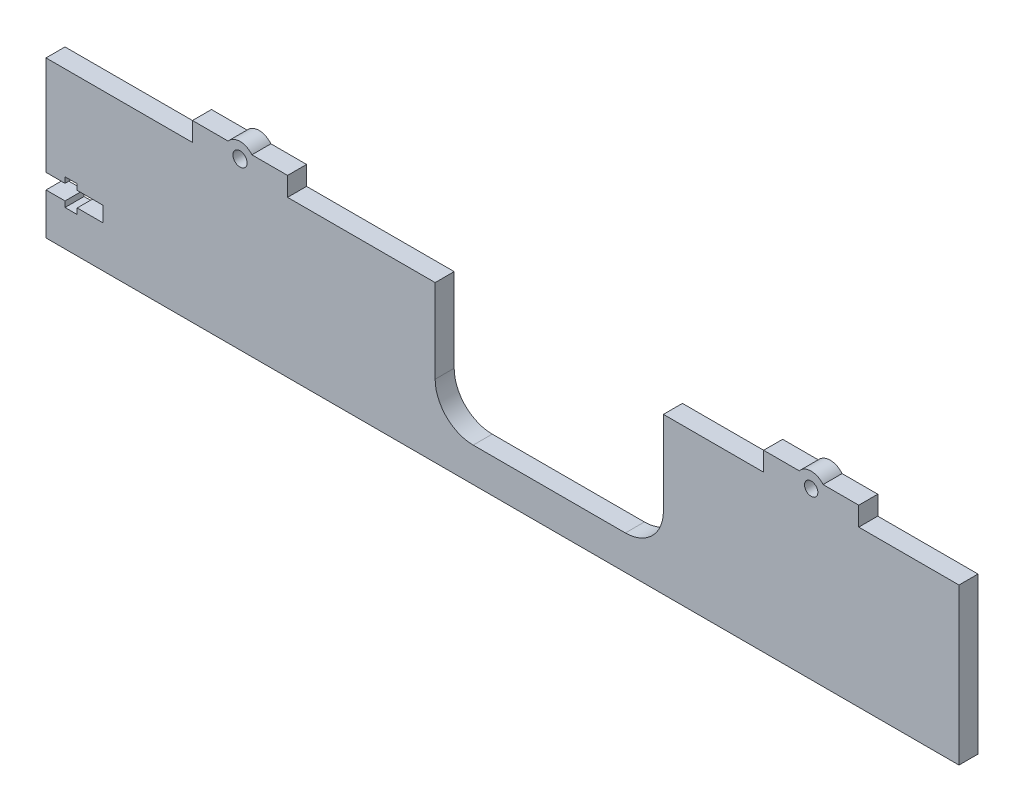
ISO-10303-21;
HEADER;
FILE_DESCRIPTION(('STEP AP214'),'2;1');
FILE_NAME('part.step','',(''),(''),'','','');
FILE_SCHEMA(('AUTOMOTIVE_DESIGN { 1 0 10303 214 1 1 1 1 }'));
ENDSEC;
DATA;
#1=APPLICATION_CONTEXT('core data for automotive mechanical design processes');
#2=APPLICATION_PROTOCOL_DEFINITION('international standard','automotive_design',2000,#1);
#3=PRODUCT_CONTEXT('',#1,'mechanical');
#4=PRODUCT('Part','Part','',(#3));
#5=PRODUCT_RELATED_PRODUCT_CATEGORY('part','',(#4));
#6=PRODUCT_DEFINITION_FORMATION('','',#4);
#7=PRODUCT_DEFINITION_CONTEXT('part definition',#1,'design');
#8=PRODUCT_DEFINITION('design','',#6,#7);
#9=PRODUCT_DEFINITION_SHAPE('','',#8);
#10=(LENGTH_UNIT() NAMED_UNIT(*) SI_UNIT(.MILLI.,.METRE.));
#11=(NAMED_UNIT(*) PLANE_ANGLE_UNIT() SI_UNIT($,.RADIAN.));
#12=(NAMED_UNIT(*) SI_UNIT($,.STERADIAN.) SOLID_ANGLE_UNIT());
#13=UNCERTAINTY_MEASURE_WITH_UNIT(LENGTH_MEASURE(1.E-05),#10,'distance_accuracy_value','');
#14=(GEOMETRIC_REPRESENTATION_CONTEXT(3) GLOBAL_UNCERTAINTY_ASSIGNED_CONTEXT((#13)) GLOBAL_UNIT_ASSIGNED_CONTEXT((#10,
#11,#12)) REPRESENTATION_CONTEXT('',''));
#15=CARTESIAN_POINT('',(0.,0.,0.));
#16=DIRECTION('',(0.,0.,1.));
#17=DIRECTION('',(1.,0.,0.));
#18=AXIS2_PLACEMENT_3D('',#15,#16,#17);
#19=CARTESIAN_POINT('',(-81.5,30.5,0.));
#20=DIRECTION('',(0.,1.,0.));
#21=DIRECTION('',(0.,0.,1.));
#22=AXIS2_PLACEMENT_3D('',#19,#20,#21);
#23=PLANE('',#22);
#24=DIRECTION('',(0.,0.,1.));
#25=VECTOR('',#24,1.);
#26=CARTESIAN_POINT('',(-72.1224989991912,30.5,0.));
#27=LINE('',#26,#25);
#28=CARTESIAN_POINT('',(-72.1224989991912,30.5,0.));
#29=VERTEX_POINT('',#28);
#30=CARTESIAN_POINT('',(-72.1224989991912,30.5,5.));
#31=VERTEX_POINT('',#30);
#32=EDGE_CURVE('E42',#29,#31,#27,.T.);
#33=ORIENTED_EDGE('',*,*,#32,.F.);
#34=DIRECTION('',(-1.,0.,0.));
#35=VECTOR('',#34,1.);
#36=CARTESIAN_POINT('',(-81.5,30.5,0.));
#37=LINE('',#36,#35);
#38=CARTESIAN_POINT('',(-81.5,30.5,0.));
#39=VERTEX_POINT('',#38);
#40=EDGE_CURVE('E395',#29,#39,#37,.T.);
#41=ORIENTED_EDGE('',*,*,#40,.T.);
#42=DIRECTION('',(0.,0.,1.));
#43=VECTOR('',#42,1.);
#44=CARTESIAN_POINT('',(-81.5,30.5,0.));
#45=LINE('',#44,#43);
#46=CARTESIAN_POINT('',(-81.5,30.5,5.));
#47=VERTEX_POINT('',#46);
#48=EDGE_CURVE('E373',#39,#47,#45,.T.);
#49=ORIENTED_EDGE('',*,*,#48,.T.);
#50=DIRECTION('',(-1.,0.,0.));
#51=VECTOR('',#50,1.);
#52=CARTESIAN_POINT('',(-81.5,30.5,5.));
#53=LINE('',#52,#51);
#54=EDGE_CURVE('E371',#31,#47,#53,.T.);
#55=ORIENTED_EDGE('',*,*,#54,.F.);
#56=EDGE_LOOP('',(#33,#41,#49,#55));
#57=FACE_BOUND('',#56,.T.);
#58=ADVANCED_FACE('F34',(#57),#23,.T.);
#59=CARTESIAN_POINT('',(68.65,30.5,0.));
#60=DIRECTION('',(0.,1.,0.));
#61=DIRECTION('',(0.,0.,1.));
#62=AXIS2_PLACEMENT_3D('',#59,#60,#61);
#63=PLANE('',#62);
#64=DIRECTION('',(0.,0.,1.));
#65=VECTOR('',#64,1.);
#66=CARTESIAN_POINT('',(78.0289907050887,30.5,0.));
#67=LINE('',#66,#65);
#68=CARTESIAN_POINT('',(78.0289907050887,30.5,0.));
#69=VERTEX_POINT('',#68);
#70=CARTESIAN_POINT('',(78.0289907050887,30.5,5.));
#71=VERTEX_POINT('',#70);
#72=EDGE_CURVE('E357',#69,#71,#67,.T.);
#73=ORIENTED_EDGE('',*,*,#72,.F.);
#74=DIRECTION('',(-1.,0.,0.));
#75=VECTOR('',#74,1.);
#76=CARTESIAN_POINT('',(68.65,30.5,0.));
#77=LINE('',#76,#75);
#78=CARTESIAN_POINT('',(68.65,30.5,0.));
#79=VERTEX_POINT('',#78);
#80=EDGE_CURVE('E466',#69,#79,#77,.T.);
#81=ORIENTED_EDGE('',*,*,#80,.T.);
#82=DIRECTION('',(0.,0.,1.));
#83=VECTOR('',#82,1.);
#84=CARTESIAN_POINT('',(68.65,30.5,0.));
#85=LINE('',#84,#83);
#86=CARTESIAN_POINT('',(68.65,30.5,5.));
#87=VERTEX_POINT('',#86);
#88=EDGE_CURVE('E479',#79,#87,#85,.T.);
#89=ORIENTED_EDGE('',*,*,#88,.T.);
#90=DIRECTION('',(-1.,0.,0.));
#91=VECTOR('',#90,1.);
#92=CARTESIAN_POINT('',(68.65,30.5,5.));
#93=LINE('',#92,#91);
#94=EDGE_CURVE('E476',#71,#87,#93,.T.);
#95=ORIENTED_EDGE('',*,*,#94,.F.);
#96=EDGE_LOOP('',(#73,#81,#89,#95));
#97=FACE_BOUND('',#96,.T.);
#98=ADVANCED_FACE('F572',(#97),#63,.T.);
#99=CARTESIAN_POINT('',(-120.,25.5,5.));
#100=DIRECTION('',(0.,-1.,0.));
#101=DIRECTION('',(0.,0.,-1.));
#102=AXIS2_PLACEMENT_3D('',#99,#100,#101);
#103=PLANE('',#102);
#104=DIRECTION('',(-1.,0.,0.));
#105=VECTOR('',#104,1.);
#106=CARTESIAN_POINT('',(-120.,25.5,5.));
#107=LINE('',#106,#105);
#108=CARTESIAN_POINT('',(68.65,25.5,5.));
#109=VERTEX_POINT('',#108);
#110=CARTESIAN_POINT('',(42.3,25.5,5.));
#111=VERTEX_POINT('',#110);
#112=EDGE_CURVE('E285',#109,#111,#107,.T.);
#113=ORIENTED_EDGE('',*,*,#112,.F.);
#114=DIRECTION('',(0.,0.,1.));
#115=VECTOR('',#114,1.);
#116=CARTESIAN_POINT('',(68.65,25.5,0.));
#117=LINE('',#116,#115);
#118=CARTESIAN_POINT('',(68.65,25.5,0.));
#119=VERTEX_POINT('',#118);
#120=EDGE_CURVE('E470',#119,#109,#117,.T.);
#121=ORIENTED_EDGE('',*,*,#120,.F.);
#122=DIRECTION('',(-1.,0.,0.));
#123=VECTOR('',#122,1.);
#124=CARTESIAN_POINT('',(-120.,25.5,0.));
#125=LINE('',#124,#123);
#126=CARTESIAN_POINT('',(42.3,25.5,0.));
#127=VERTEX_POINT('',#126);
#128=EDGE_CURVE('E295',#119,#127,#125,.T.);
#129=ORIENTED_EDGE('',*,*,#128,.T.);
#130=DIRECTION('',(0.,0.,1.));
#131=VECTOR('',#130,1.);
#132=CARTESIAN_POINT('',(42.3,25.5,-5.));
#133=LINE('',#132,#131);
#134=EDGE_CURVE('E507',#127,#111,#133,.T.);
#135=ORIENTED_EDGE('',*,*,#134,.T.);
#136=EDGE_LOOP('',(#113,#121,#129,#135));
#137=FACE_BOUND('',#136,.T.);
#138=ADVANCED_FACE('F567',(#137),#103,.F.);
#139=CARTESIAN_POINT('',(-17.7,25.5,5.));
#140=VERTEX_POINT('',#139);
#141=CARTESIAN_POINT('',(-56.5,25.5,5.));
#142=VERTEX_POINT('',#141);
#143=EDGE_CURVE('E277',#140,#142,#107,.T.);
#144=ORIENTED_EDGE('',*,*,#143,.F.);
#145=DIRECTION('',(0.,0.,1.));
#146=VECTOR('',#145,1.);
#147=CARTESIAN_POINT('',(-17.7,25.5,-5.));
#148=LINE('',#147,#146);
#149=CARTESIAN_POINT('',(-17.7,25.5,0.));
#150=VERTEX_POINT('',#149);
#151=EDGE_CURVE('E504',#150,#140,#148,.T.);
#152=ORIENTED_EDGE('',*,*,#151,.F.);
#153=CARTESIAN_POINT('',(-56.5,25.5,0.));
#154=VERTEX_POINT('',#153);
#155=EDGE_CURVE('E594',#150,#154,#125,.T.);
#156=ORIENTED_EDGE('',*,*,#155,.T.);
#157=DIRECTION('',(0.,0.,1.));
#158=VECTOR('',#157,1.);
#159=CARTESIAN_POINT('',(-56.5,25.5,0.));
#160=LINE('',#159,#158);
#161=EDGE_CURVE('E388',#154,#142,#160,.T.);
#162=ORIENTED_EDGE('',*,*,#161,.T.);
#163=EDGE_LOOP('',(#144,#152,#156,#162));
#164=FACE_BOUND('',#163,.T.);
#165=ADVANCED_FACE('F559',(#164),#103,.F.);
#166=CARTESIAN_POINT('',(-120.,25.5,5.));
#167=DIRECTION('',(1.,0.,0.));
#168=DIRECTION('',(0.,1.,0.));
#169=AXIS2_PLACEMENT_3D('',#166,#167,#168);
#170=PLANE('',#169);
#171=DIRECTION('',(0.,-1.,0.));
#172=VECTOR('',#171,1.);
#173=CARTESIAN_POINT('',(-120.,25.5,0.));
#174=LINE('',#173,#172);
#175=CARTESIAN_POINT('',(-120.,-4.56215806071958,0.));
#176=VERTEX_POINT('',#175);
#177=CARTESIAN_POINT('',(-120.,-15.5,0.));
#178=VERTEX_POINT('',#177);
#179=EDGE_CURVE('E290',#176,#178,#174,.T.);
#180=ORIENTED_EDGE('',*,*,#179,.T.);
#181=DIRECTION('',(0.,0.,1.));
#182=VECTOR('',#181,1.);
#183=CARTESIAN_POINT('',(-120.,-15.5,-5.));
#184=LINE('',#183,#182);
#185=CARTESIAN_POINT('',(-120.,-15.5,5.));
#186=VERTEX_POINT('',#185);
#187=EDGE_CURVE('E49',#178,#186,#184,.T.);
#188=ORIENTED_EDGE('',*,*,#187,.T.);
#189=DIRECTION('',(0.,-1.,0.));
#190=VECTOR('',#189,1.);
#191=CARTESIAN_POINT('',(-120.,25.5,5.));
#192=LINE('',#191,#190);
#193=CARTESIAN_POINT('',(-120.,-4.56215806071958,5.));
#194=VERTEX_POINT('',#193);
#195=EDGE_CURVE('E268',#194,#186,#192,.T.);
#196=ORIENTED_EDGE('',*,*,#195,.F.);
#197=DIRECTION('',(0.,0.,1.));
#198=VECTOR('',#197,1.);
#199=CARTESIAN_POINT('',(-120.,-4.56215806071958,-5.));
#200=LINE('',#199,#198);
#201=EDGE_CURVE('E404',#176,#194,#200,.T.);
#202=ORIENTED_EDGE('',*,*,#201,.F.);
#203=EDGE_LOOP('',(#180,#188,#196,#202));
#204=FACE_BOUND('',#203,.T.);
#205=ADVANCED_FACE('F556',(#204),#170,.F.);
#206=DIRECTION('',(0.,0.,1.));
#207=VECTOR('',#206,1.);
#208=CARTESIAN_POINT('',(-81.5,25.5,0.));
#209=LINE('',#208,#207);
#210=CARTESIAN_POINT('',(-81.5,25.5,0.));
#211=VERTEX_POINT('',#210);
#212=CARTESIAN_POINT('',(-81.5,25.5,5.));
#213=VERTEX_POINT('',#212);
#214=EDGE_CURVE('E390',#211,#213,#209,.T.);
#215=ORIENTED_EDGE('',*,*,#214,.F.);
#216=CARTESIAN_POINT('',(-120.,25.5,0.));
#217=VERTEX_POINT('',#216);
#218=EDGE_CURVE('E292',#211,#217,#125,.T.);
#219=ORIENTED_EDGE('',*,*,#218,.T.);
#220=DIRECTION('',(0.,0.,-1.));
#221=VECTOR('',#220,1.);
#222=CARTESIAN_POINT('',(-120.,25.5,5.));
#223=LINE('',#222,#221);
#224=CARTESIAN_POINT('',(-120.,25.5,5.));
#225=VERTEX_POINT('',#224);
#226=EDGE_CURVE('E284',#225,#217,#223,.T.);
#227=ORIENTED_EDGE('',*,*,#226,.F.);
#228=EDGE_CURVE('E274',#213,#225,#107,.T.);
#229=ORIENTED_EDGE('',*,*,#228,.F.);
#230=EDGE_LOOP('',(#215,#219,#227,#229));
#231=FACE_BOUND('',#230,.T.);
#232=ADVANCED_FACE('F558',(#231),#103,.F.);
#233=CARTESIAN_POINT('',(-120.,-0.562158060719575,0.));
#234=VERTEX_POINT('',#233);
#235=EDGE_CURVE('E286',#217,#234,#174,.T.);
#236=ORIENTED_EDGE('',*,*,#235,.T.);
#237=DIRECTION('',(0.,0.,1.));
#238=VECTOR('',#237,1.);
#239=CARTESIAN_POINT('',(-120.,-0.562158060719575,-5.));
#240=LINE('',#239,#238);
#241=CARTESIAN_POINT('',(-120.,-0.562158060719575,5.));
#242=VERTEX_POINT('',#241);
#243=EDGE_CURVE('E410',#234,#242,#240,.T.);
#244=ORIENTED_EDGE('',*,*,#243,.T.);
#245=EDGE_CURVE('E275',#225,#242,#192,.T.);
#246=ORIENTED_EDGE('',*,*,#245,.F.);
#247=ORIENTED_EDGE('',*,*,#226,.T.);
#248=EDGE_LOOP('',(#236,#244,#246,#247));
#249=FACE_BOUND('',#248,.T.);
#250=ADVANCED_FACE('F36',(#249),#170,.F.);
#251=CARTESIAN_POINT('',(120.,25.5,5.));
#252=DIRECTION('',(-1.,0.,0.));
#253=DIRECTION('',(0.,0.,1.));
#254=AXIS2_PLACEMENT_3D('',#251,#252,#253);
#255=PLANE('',#254);
#256=DIRECTION('',(0.,1.,0.));
#257=VECTOR('',#256,1.);
#258=CARTESIAN_POINT('',(120.,25.5,5.));
#259=LINE('',#258,#257);
#260=CARTESIAN_POINT('',(120.,-15.5,5.));
#261=VERTEX_POINT('',#260);
#262=CARTESIAN_POINT('',(120.,25.5,5.));
#263=VERTEX_POINT('',#262);
#264=EDGE_CURVE('E264',#261,#263,#259,.T.);
#265=ORIENTED_EDGE('',*,*,#264,.F.);
#266=DIRECTION('',(0.,0.,1.));
#267=VECTOR('',#266,1.);
#268=CARTESIAN_POINT('',(120.,-15.5,-5.));
#269=LINE('',#268,#267);
#270=CARTESIAN_POINT('',(120.,-15.5,0.));
#271=VERTEX_POINT('',#270);
#272=EDGE_CURVE('E252',#271,#261,#269,.T.);
#273=ORIENTED_EDGE('',*,*,#272,.F.);
#274=DIRECTION('',(0.,1.,0.));
#275=VECTOR('',#274,1.);
#276=CARTESIAN_POINT('',(120.,25.5,0.));
#277=LINE('',#276,#275);
#278=CARTESIAN_POINT('',(120.,25.5,0.));
#279=VERTEX_POINT('',#278);
#280=EDGE_CURVE('E289',#271,#279,#277,.T.);
#281=ORIENTED_EDGE('',*,*,#280,.T.);
#282=DIRECTION('',(0.,0.,-1.));
#283=VECTOR('',#282,1.);
#284=CARTESIAN_POINT('',(120.,25.5,5.));
#285=LINE('',#284,#283);
#286=EDGE_CURVE('E272',#263,#279,#285,.T.);
#287=ORIENTED_EDGE('',*,*,#286,.F.);
#288=EDGE_LOOP('',(#265,#273,#281,#287));
#289=FACE_BOUND('',#288,.T.);
#290=ADVANCED_FACE('F270',(#289),#255,.F.);
#291=CARTESIAN_POINT('',(93.65,25.5,0.));
#292=VERTEX_POINT('',#291);
#293=EDGE_CURVE('E293',#279,#292,#125,.T.);
#294=ORIENTED_EDGE('',*,*,#293,.T.);
#295=DIRECTION('',(0.,0.,1.));
#296=VECTOR('',#295,1.);
#297=CARTESIAN_POINT('',(93.65,25.5,0.));
#298=LINE('',#297,#296);
#299=CARTESIAN_POINT('',(93.65,25.5,5.));
#300=VERTEX_POINT('',#299);
#301=EDGE_CURVE('E485',#292,#300,#298,.T.);
#302=ORIENTED_EDGE('',*,*,#301,.T.);
#303=EDGE_CURVE('E279',#263,#300,#107,.T.);
#304=ORIENTED_EDGE('',*,*,#303,.F.);
#305=ORIENTED_EDGE('',*,*,#286,.T.);
#306=EDGE_LOOP('',(#294,#302,#304,#305));
#307=FACE_BOUND('',#306,.T.);
#308=ADVANCED_FACE('F566',(#307),#103,.F.);
#309=CARTESIAN_POINT('',(0.,0.,5.));
#310=DIRECTION('',(0.,0.,1.));
#311=DIRECTION('',(1.,0.,0.));
#312=AXIS2_PLACEMENT_3D('',#309,#310,#311);
#313=PLANE('',#312);
#314=DIRECTION('',(-1.,0.,0.));
#315=VECTOR('',#314,1.);
#316=CARTESIAN_POINT('',(-120.,-15.5,5.));
#317=LINE('',#316,#315);
#318=EDGE_CURVE('E255',#261,#186,#317,.T.);
#319=ORIENTED_EDGE('',*,*,#318,.F.);
#320=ORIENTED_EDGE('',*,*,#264,.T.);
#321=ORIENTED_EDGE('',*,*,#303,.T.);
#322=DIRECTION('',(0.,1.,0.));
#323=VECTOR('',#322,1.);
#324=CARTESIAN_POINT('',(93.65,25.5,5.));
#325=LINE('',#324,#323);
#326=CARTESIAN_POINT('',(93.65,30.5,5.));
#327=VERTEX_POINT('',#326);
#328=EDGE_CURVE('E473',#300,#327,#325,.T.);
#329=ORIENTED_EDGE('',*,*,#328,.T.);
#330=CARTESIAN_POINT('',(84.273988703487,30.5,5.));
#331=VERTEX_POINT('',#330);
#332=EDGE_CURVE('E463',#327,#331,#93,.T.);
#333=ORIENTED_EDGE('',*,*,#332,.T.);
#334=CARTESIAN_POINT('',(81.1514897042878,28.,5.));
#335=DIRECTION('',(0.,0.,1.));
#336=DIRECTION('',(1.,0.,0.));
#337=AXIS2_PLACEMENT_3D('',#334,#335,#336);
#338=CIRCLE('',#337,4.00000000000001);
#339=EDGE_CURVE('E446',#331,#71,#338,.T.);
#340=ORIENTED_EDGE('',*,*,#339,.T.);
#341=ORIENTED_EDGE('',*,*,#94,.T.);
#342=DIRECTION('',(0.,-1.,0.));
#343=VECTOR('',#342,1.);
#344=CARTESIAN_POINT('',(68.65,25.5,5.));
#345=LINE('',#344,#343);
#346=EDGE_CURVE('E355',#87,#109,#345,.T.);
#347=ORIENTED_EDGE('',*,*,#346,.T.);
#348=ORIENTED_EDGE('',*,*,#112,.T.);
#349=DIRECTION('',(0.,1.,0.));
#350=VECTOR('',#349,1.);
#351=CARTESIAN_POINT('',(42.3,25.5,5.));
#352=LINE('',#351,#350);
#353=CARTESIAN_POINT('',(42.3,3.50000000000007,5.));
#354=VERTEX_POINT('',#353);
#355=EDGE_CURVE('E500',#354,#111,#352,.T.);
#356=ORIENTED_EDGE('',*,*,#355,.F.);
#357=CARTESIAN_POINT('',(32.3,3.5,5.));
#358=DIRECTION('',(0.,0.,1.));
#359=DIRECTION('',(1.,0.,0.));
#360=AXIS2_PLACEMENT_3D('',#357,#358,#359);
#361=CIRCLE('',#360,9.99999999999999);
#362=CARTESIAN_POINT('',(32.2999999999999,-6.5,5.));
#363=VERTEX_POINT('',#362);
#364=EDGE_CURVE('E497',#363,#354,#361,.T.);
#365=ORIENTED_EDGE('',*,*,#364,.F.);
#366=DIRECTION('',(1.,0.,0.));
#367=VECTOR('',#366,1.);
#368=CARTESIAN_POINT('',(-7.69999999999992,-6.5,5.));
#369=LINE('',#368,#367);
#370=CARTESIAN_POINT('',(-7.69999999999992,-6.5,5.));
#371=VERTEX_POINT('',#370);
#372=EDGE_CURVE('E494',#371,#363,#369,.T.);
#373=ORIENTED_EDGE('',*,*,#372,.F.);
#374=CARTESIAN_POINT('',(-7.69999999999999,3.5,5.));
#375=DIRECTION('',(0.,0.,1.));
#376=DIRECTION('',(1.,0.,0.));
#377=AXIS2_PLACEMENT_3D('',#374,#375,#376);
#378=CIRCLE('',#377,10.);
#379=CARTESIAN_POINT('',(-17.7,3.50000000000007,5.));
#380=VERTEX_POINT('',#379);
#381=EDGE_CURVE('E491',#380,#371,#378,.T.);
#382=ORIENTED_EDGE('',*,*,#381,.F.);
#383=DIRECTION('',(0.,-1.,0.));
#384=VECTOR('',#383,1.);
#385=CARTESIAN_POINT('',(-17.7,25.5,5.));
#386=LINE('',#385,#384);
#387=EDGE_CURVE('E482',#140,#380,#386,.T.);
#388=ORIENTED_EDGE('',*,*,#387,.F.);
#389=ORIENTED_EDGE('',*,*,#143,.T.);
#390=DIRECTION('',(0.,1.,0.));
#391=VECTOR('',#390,1.);
#392=CARTESIAN_POINT('',(-56.5,25.5,5.));
#393=LINE('',#392,#391);
#394=CARTESIAN_POINT('',(-56.5,30.5,5.));
#395=VERTEX_POINT('',#394);
#396=EDGE_CURVE('E377',#142,#395,#393,.T.);
#397=ORIENTED_EDGE('',*,*,#396,.T.);
#398=CARTESIAN_POINT('',(-65.8775010007928,30.5,5.));
#399=VERTEX_POINT('',#398);
#400=EDGE_CURVE('E376',#395,#399,#53,.T.);
#401=ORIENTED_EDGE('',*,*,#400,.T.);
#402=CARTESIAN_POINT('',(-68.999999999992,28.,5.));
#403=DIRECTION('',(0.,0.,1.));
#404=DIRECTION('',(1.,0.,0.));
#405=AXIS2_PLACEMENT_3D('',#402,#403,#404);
#406=CIRCLE('',#405,4.00000000000001);
#407=EDGE_CURVE('E56',#399,#31,#406,.T.);
#408=ORIENTED_EDGE('',*,*,#407,.T.);
#409=ORIENTED_EDGE('',*,*,#54,.T.);
#410=DIRECTION('',(0.,-1.,0.));
#411=VECTOR('',#410,1.);
#412=CARTESIAN_POINT('',(-81.5,25.5,5.));
#413=LINE('',#412,#411);
#414=EDGE_CURVE('E381',#47,#213,#413,.T.);
#415=ORIENTED_EDGE('',*,*,#414,.T.);
#416=ORIENTED_EDGE('',*,*,#228,.T.);
#417=ORIENTED_EDGE('',*,*,#245,.T.);
#418=DIRECTION('',(-1.,0.,0.));
#419=VECTOR('',#418,1.);
#420=CARTESIAN_POINT('',(-120.,-0.562158060719575,5.));
#421=LINE('',#420,#419);
#422=CARTESIAN_POINT('',(-115.,-0.562158060719576,5.));
#423=VERTEX_POINT('',#422);
#424=EDGE_CURVE('E541',#423,#242,#421,.T.);
#425=ORIENTED_EDGE('',*,*,#424,.F.);
#426=DIRECTION('',(0.,-1.,0.));
#427=VECTOR('',#426,1.);
#428=CARTESIAN_POINT('',(-115.,0.937841939280424,5.));
#429=LINE('',#428,#427);
#430=CARTESIAN_POINT('',(-115.,0.937841939280424,5.));
#431=VERTEX_POINT('',#430);
#432=EDGE_CURVE('E539',#431,#423,#429,.T.);
#433=ORIENTED_EDGE('',*,*,#432,.F.);
#434=DIRECTION('',(-1.,0.,0.));
#435=VECTOR('',#434,1.);
#436=CARTESIAN_POINT('',(-111.8,0.937841939280424,5.));
#437=LINE('',#436,#435);
#438=CARTESIAN_POINT('',(-111.8,0.937841939280424,5.));
#439=VERTEX_POINT('',#438);
#440=EDGE_CURVE('E536',#439,#431,#437,.T.);
#441=ORIENTED_EDGE('',*,*,#440,.F.);
#442=DIRECTION('',(0.,1.,0.));
#443=VECTOR('',#442,1.);
#444=CARTESIAN_POINT('',(-111.8,-0.562158060719576,5.));
#445=LINE('',#444,#443);
#446=CARTESIAN_POINT('',(-111.8,-0.562158060719576,5.));
#447=VERTEX_POINT('',#446);
#448=EDGE_CURVE('E533',#447,#439,#445,.T.);
#449=ORIENTED_EDGE('',*,*,#448,.F.);
#450=DIRECTION('',(-1.,0.,0.));
#451=VECTOR('',#450,1.);
#452=CARTESIAN_POINT('',(-111.8,-0.562158060719576,5.));
#453=LINE('',#452,#451);
#454=CARTESIAN_POINT('',(-105.,-0.562158060719578,5.));
#455=VERTEX_POINT('',#454);
#456=EDGE_CURVE('E530',#455,#447,#453,.T.);
#457=ORIENTED_EDGE('',*,*,#456,.F.);
#458=DIRECTION('',(0.,1.,0.));
#459=VECTOR('',#458,1.);
#460=CARTESIAN_POINT('',(-105.,-0.562158060719578,5.));
#461=LINE('',#460,#459);
#462=CARTESIAN_POINT('',(-105.,-4.56215806071958,5.));
#463=VERTEX_POINT('',#462);
#464=EDGE_CURVE('E527',#463,#455,#461,.T.);
#465=ORIENTED_EDGE('',*,*,#464,.F.);
#466=DIRECTION('',(1.,0.,0.));
#467=VECTOR('',#466,1.);
#468=CARTESIAN_POINT('',(-105.,-4.56215806071958,5.));
#469=LINE('',#468,#467);
#470=CARTESIAN_POINT('',(-111.8,-4.56215806071958,5.));
#471=VERTEX_POINT('',#470);
#472=EDGE_CURVE('E524',#471,#463,#469,.T.);
#473=ORIENTED_EDGE('',*,*,#472,.F.);
#474=DIRECTION('',(0.,1.,0.));
#475=VECTOR('',#474,1.);
#476=CARTESIAN_POINT('',(-111.8,-6.06215806071958,5.));
#477=LINE('',#476,#475);
#478=CARTESIAN_POINT('',(-111.8,-6.06215806071958,5.));
#479=VERTEX_POINT('',#478);
#480=EDGE_CURVE('E521',#479,#471,#477,.T.);
#481=ORIENTED_EDGE('',*,*,#480,.F.);
#482=DIRECTION('',(1.,0.,0.));
#483=VECTOR('',#482,1.);
#484=CARTESIAN_POINT('',(-115.,-6.06215806071958,5.));
#485=LINE('',#484,#483);
#486=CARTESIAN_POINT('',(-115.,-6.06215806071958,5.));
#487=VERTEX_POINT('',#486);
#488=EDGE_CURVE('E518',#487,#479,#485,.T.);
#489=ORIENTED_EDGE('',*,*,#488,.F.);
#490=DIRECTION('',(0.,-1.,0.));
#491=VECTOR('',#490,1.);
#492=CARTESIAN_POINT('',(-115.,-4.56215806071958,5.));
#493=LINE('',#492,#491);
#494=CARTESIAN_POINT('',(-115.,-4.56215806071958,5.));
#495=VERTEX_POINT('',#494);
#496=EDGE_CURVE('E506',#495,#487,#493,.T.);
#497=ORIENTED_EDGE('',*,*,#496,.F.);
#498=DIRECTION('',(1.,0.,0.));
#499=VECTOR('',#498,1.);
#500=CARTESIAN_POINT('',(-115.,-4.56215806071958,5.));
#501=LINE('',#500,#499);
#502=EDGE_CURVE('E413',#194,#495,#501,.T.);
#503=ORIENTED_EDGE('',*,*,#502,.F.);
#504=ORIENTED_EDGE('',*,*,#195,.T.);
#505=EDGE_LOOP('',(#319,#320,#321,#329,#333,#340,#341,#347,#348,#356,#365,#373,#382,#388,#389,
#397,#401,#408,#409,#415,#416,#417,#425,#433,#441,#449,#457,#465,#473,#481,#489,#497,#503,#504));
#506=FACE_BOUND('',#505,.T.);
#507=CARTESIAN_POINT('',(81.1514897042878,28.,5.));
#508=DIRECTION('',(0.,0.,1.));
#509=DIRECTION('',(1.,0.,0.));
#510=AXIS2_PLACEMENT_3D('',#507,#508,#509);
#511=CIRCLE('',#510,1.74832903256121);
#512=CARTESIAN_POINT('',(82.8998187368491,28.,5.));
#513=VERTEX_POINT('',#512);
#514=EDGE_CURVE('E453',#513,#513,#511,.T.);
#515=ORIENTED_EDGE('',*,*,#514,.F.);
#516=EDGE_LOOP('',(#515));
#517=FACE_BOUND('',#516,.T.);
#518=CARTESIAN_POINT('',(-68.999999999992,28.,5.));
#519=DIRECTION('',(0.,0.,1.));
#520=DIRECTION('',(1.,0.,0.));
#521=AXIS2_PLACEMENT_3D('',#518,#519,#520);
#522=CIRCLE('',#521,1.86392887683881);
#523=CARTESIAN_POINT('',(-67.1360711231532,28.,5.));
#524=VERTEX_POINT('',#523);
#525=EDGE_CURVE('E352',#524,#524,#522,.T.);
#526=ORIENTED_EDGE('',*,*,#525,.F.);
#527=EDGE_LOOP('',(#526));
#528=FACE_BOUND('',#527,.T.);
#529=ADVANCED_FACE('F261',(#506,#517,#528),#313,.T.);
#530=CARTESIAN_POINT('',(0.,0.,0.));
#531=DIRECTION('',(0.,0.,1.));
#532=DIRECTION('',(1.,0.,0.));
#533=AXIS2_PLACEMENT_3D('',#530,#531,#532);
#534=PLANE('',#533);
#535=ORIENTED_EDGE('',*,*,#280,.F.);
#536=DIRECTION('',(-1.,0.,0.));
#537=VECTOR('',#536,1.);
#538=CARTESIAN_POINT('',(0.,-15.5,0.));
#539=LINE('',#538,#537);
#540=EDGE_CURVE('E11',#271,#178,#539,.T.);
#541=ORIENTED_EDGE('',*,*,#540,.T.);
#542=ORIENTED_EDGE('',*,*,#179,.F.);
#543=DIRECTION('',(1.,0.,0.));
#544=VECTOR('',#543,1.);
#545=CARTESIAN_POINT('',(0.,-4.56215806071958,0.));
#546=LINE('',#545,#544);
#547=CARTESIAN_POINT('',(-115.,-4.56215806071958,0.));
#548=VERTEX_POINT('',#547);
#549=EDGE_CURVE('E329',#176,#548,#546,.T.);
#550=ORIENTED_EDGE('',*,*,#549,.T.);
#551=DIRECTION('',(0.,-1.,0.));
#552=VECTOR('',#551,1.);
#553=CARTESIAN_POINT('',(-115.,0.,0.));
#554=LINE('',#553,#552);
#555=CARTESIAN_POINT('',(-115.,-6.06215806071958,0.));
#556=VERTEX_POINT('',#555);
#557=EDGE_CURVE('E326',#548,#556,#554,.T.);
#558=ORIENTED_EDGE('',*,*,#557,.T.);
#559=DIRECTION('',(1.,0.,0.));
#560=VECTOR('',#559,1.);
#561=CARTESIAN_POINT('',(0.,-6.06215806071958,0.));
#562=LINE('',#561,#560);
#563=CARTESIAN_POINT('',(-111.8,-6.06215806071958,0.));
#564=VERTEX_POINT('',#563);
#565=EDGE_CURVE('E299',#556,#564,#562,.T.);
#566=ORIENTED_EDGE('',*,*,#565,.T.);
#567=DIRECTION('',(0.,1.,0.));
#568=VECTOR('',#567,1.);
#569=CARTESIAN_POINT('',(-111.8,0.,0.));
#570=LINE('',#569,#568);
#571=CARTESIAN_POINT('',(-111.8,-4.56215806071958,0.));
#572=VERTEX_POINT('',#571);
#573=EDGE_CURVE('E302',#564,#572,#570,.T.);
#574=ORIENTED_EDGE('',*,*,#573,.T.);
#575=DIRECTION('',(1.,0.,0.));
#576=VECTOR('',#575,1.);
#577=CARTESIAN_POINT('',(0.,-4.56215806071958,0.));
#578=LINE('',#577,#576);
#579=CARTESIAN_POINT('',(-105.,-4.56215806071958,0.));
#580=VERTEX_POINT('',#579);
#581=EDGE_CURVE('E305',#572,#580,#578,.T.);
#582=ORIENTED_EDGE('',*,*,#581,.T.);
#583=DIRECTION('',(0.,1.,0.));
#584=VECTOR('',#583,1.);
#585=CARTESIAN_POINT('',(-105.,0.,0.));
#586=LINE('',#585,#584);
#587=CARTESIAN_POINT('',(-105.,-0.562158060719578,0.));
#588=VERTEX_POINT('',#587);
#589=EDGE_CURVE('E308',#580,#588,#586,.T.);
#590=ORIENTED_EDGE('',*,*,#589,.T.);
#591=DIRECTION('',(-1.,0.,0.));
#592=VECTOR('',#591,1.);
#593=CARTESIAN_POINT('',(0.,-0.56215806071961,0.));
#594=LINE('',#593,#592);
#595=CARTESIAN_POINT('',(-111.8,-0.562158060719576,0.));
#596=VERTEX_POINT('',#595);
#597=EDGE_CURVE('E311',#588,#596,#594,.T.);
#598=ORIENTED_EDGE('',*,*,#597,.T.);
#599=DIRECTION('',(0.,1.,0.));
#600=VECTOR('',#599,1.);
#601=CARTESIAN_POINT('',(-111.8,0.,0.));
#602=LINE('',#601,#600);
#603=CARTESIAN_POINT('',(-111.8,0.937841939280424,0.));
#604=VERTEX_POINT('',#603);
#605=EDGE_CURVE('E314',#596,#604,#602,.T.);
#606=ORIENTED_EDGE('',*,*,#605,.T.);
#607=DIRECTION('',(-1.,0.,0.));
#608=VECTOR('',#607,1.);
#609=CARTESIAN_POINT('',(0.,0.937841939280424,0.));
#610=LINE('',#609,#608);
#611=CARTESIAN_POINT('',(-115.,0.937841939280424,0.));
#612=VERTEX_POINT('',#611);
#613=EDGE_CURVE('E317',#604,#612,#610,.T.);
#614=ORIENTED_EDGE('',*,*,#613,.T.);
#615=DIRECTION('',(0.,-1.,0.));
#616=VECTOR('',#615,1.);
#617=CARTESIAN_POINT('',(-115.,0.,0.));
#618=LINE('',#617,#616);
#619=CARTESIAN_POINT('',(-115.,-0.562158060719576,0.));
#620=VERTEX_POINT('',#619);
#621=EDGE_CURVE('E320',#612,#620,#618,.T.);
#622=ORIENTED_EDGE('',*,*,#621,.T.);
#623=DIRECTION('',(-1.,0.,0.));
#624=VECTOR('',#623,1.);
#625=CARTESIAN_POINT('',(0.,-0.562158060719586,0.));
#626=LINE('',#625,#624);
#627=EDGE_CURVE('E323',#620,#234,#626,.T.);
#628=ORIENTED_EDGE('',*,*,#627,.T.);
#629=ORIENTED_EDGE('',*,*,#235,.F.);
#630=ORIENTED_EDGE('',*,*,#218,.F.);
#631=DIRECTION('',(0.,-1.,0.));
#632=VECTOR('',#631,1.);
#633=CARTESIAN_POINT('',(-81.5,25.5,0.));
#634=LINE('',#633,#632);
#635=EDGE_CURVE('E379',#39,#211,#634,.T.);
#636=ORIENTED_EDGE('',*,*,#635,.F.);
#637=ORIENTED_EDGE('',*,*,#40,.F.);
#638=CARTESIAN_POINT('',(-68.999999999992,28.,0.));
#639=DIRECTION('',(0.,0.,1.));
#640=DIRECTION('',(1.,0.,0.));
#641=AXIS2_PLACEMENT_3D('',#638,#639,#640);
#642=CIRCLE('',#641,4.00000000000001);
#643=CARTESIAN_POINT('',(-65.8775010007928,30.5,0.));
#644=VERTEX_POINT('',#643);
#645=EDGE_CURVE('E367',#644,#29,#642,.T.);
#646=ORIENTED_EDGE('',*,*,#645,.F.);
#647=CARTESIAN_POINT('',(-56.5,30.5,0.));
#648=VERTEX_POINT('',#647);
#649=EDGE_CURVE('E391',#648,#644,#37,.T.);
#650=ORIENTED_EDGE('',*,*,#649,.F.);
#651=DIRECTION('',(0.,1.,0.));
#652=VECTOR('',#651,1.);
#653=CARTESIAN_POINT('',(-56.5,25.5,0.));
#654=LINE('',#653,#652);
#655=EDGE_CURVE('E399',#154,#648,#654,.T.);
#656=ORIENTED_EDGE('',*,*,#655,.F.);
#657=ORIENTED_EDGE('',*,*,#155,.F.);
#658=DIRECTION('',(0.,-1.,0.));
#659=VECTOR('',#658,1.);
#660=CARTESIAN_POINT('',(-17.7,0.,0.));
#661=LINE('',#660,#659);
#662=CARTESIAN_POINT('',(-17.7,3.50000000000007,0.));
#663=VERTEX_POINT('',#662);
#664=EDGE_CURVE('E344',#150,#663,#661,.T.);
#665=ORIENTED_EDGE('',*,*,#664,.T.);
#666=CARTESIAN_POINT('',(-7.69999999999999,3.5,0.));
#667=DIRECTION('',(0.,0.,1.));
#668=DIRECTION('',(1.,0.,0.));
#669=AXIS2_PLACEMENT_3D('',#666,#667,#668);
#670=CIRCLE('',#669,10.);
#671=CARTESIAN_POINT('',(-7.69999999999992,-6.5,0.));
#672=VERTEX_POINT('',#671);
#673=EDGE_CURVE('E332',#663,#672,#670,.T.);
#674=ORIENTED_EDGE('',*,*,#673,.T.);
#675=DIRECTION('',(1.,0.,0.));
#676=VECTOR('',#675,1.);
#677=CARTESIAN_POINT('',(0.,-6.5,0.));
#678=LINE('',#677,#676);
#679=CARTESIAN_POINT('',(32.2999999999999,-6.5,0.));
#680=VERTEX_POINT('',#679);
#681=EDGE_CURVE('E335',#672,#680,#678,.T.);
#682=ORIENTED_EDGE('',*,*,#681,.T.);
#683=CARTESIAN_POINT('',(32.3,3.5,0.));
#684=DIRECTION('',(0.,0.,1.));
#685=DIRECTION('',(1.,0.,0.));
#686=AXIS2_PLACEMENT_3D('',#683,#684,#685);
#687=CIRCLE('',#686,9.99999999999999);
#688=CARTESIAN_POINT('',(42.3,3.50000000000007,0.));
#689=VERTEX_POINT('',#688);
#690=EDGE_CURVE('E338',#680,#689,#687,.T.);
#691=ORIENTED_EDGE('',*,*,#690,.T.);
#692=DIRECTION('',(0.,1.,0.));
#693=VECTOR('',#692,1.);
#694=CARTESIAN_POINT('',(42.3,0.,0.));
#695=LINE('',#694,#693);
#696=EDGE_CURVE('E341',#689,#127,#695,.T.);
#697=ORIENTED_EDGE('',*,*,#696,.T.);
#698=ORIENTED_EDGE('',*,*,#128,.F.);
#699=DIRECTION('',(0.,-1.,0.));
#700=VECTOR('',#699,1.);
#701=CARTESIAN_POINT('',(68.65,25.5,0.));
#702=LINE('',#701,#700);
#703=EDGE_CURVE('E459',#79,#119,#702,.T.);
#704=ORIENTED_EDGE('',*,*,#703,.F.);
#705=ORIENTED_EDGE('',*,*,#80,.F.);
#706=CARTESIAN_POINT('',(81.1514897042878,28.,0.));
#707=DIRECTION('',(0.,0.,1.));
#708=DIRECTION('',(1.,0.,0.));
#709=AXIS2_PLACEMENT_3D('',#706,#707,#708);
#710=CIRCLE('',#709,4.00000000000001);
#711=CARTESIAN_POINT('',(84.273988703487,30.5,0.));
#712=VERTEX_POINT('',#711);
#713=EDGE_CURVE('E448',#712,#69,#710,.T.);
#714=ORIENTED_EDGE('',*,*,#713,.F.);
#715=CARTESIAN_POINT('',(93.65,30.5,0.));
#716=VERTEX_POINT('',#715);
#717=EDGE_CURVE('E467',#716,#712,#77,.T.);
#718=ORIENTED_EDGE('',*,*,#717,.F.);
#719=DIRECTION('',(0.,1.,0.));
#720=VECTOR('',#719,1.);
#721=CARTESIAN_POINT('',(93.65,25.5,0.));
#722=LINE('',#721,#720);
#723=EDGE_CURVE('E462',#292,#716,#722,.T.);
#724=ORIENTED_EDGE('',*,*,#723,.F.);
#725=ORIENTED_EDGE('',*,*,#293,.F.);
#726=EDGE_LOOP('',(#535,#541,#542,#550,#558,#566,#574,#582,#590,#598,#606,#614,#622,#628,#629,
#630,#636,#637,#646,#650,#656,#657,#665,#674,#682,#691,#697,#698,#704,#705,#714,#718,#724,#725));
#727=FACE_BOUND('',#726,.T.);
#728=CARTESIAN_POINT('',(81.1514897042878,28.,0.));
#729=DIRECTION('',(0.,0.,1.));
#730=DIRECTION('',(1.,0.,0.));
#731=AXIS2_PLACEMENT_3D('',#728,#729,#730);
#732=CIRCLE('',#731,1.74832903256121);
#733=CARTESIAN_POINT('',(82.8998187368491,28.,0.));
#734=VERTEX_POINT('',#733);
#735=EDGE_CURVE('E348',#734,#734,#732,.T.);
#736=ORIENTED_EDGE('',*,*,#735,.T.);
#737=EDGE_LOOP('',(#736));
#738=FACE_BOUND('',#737,.T.);
#739=CARTESIAN_POINT('',(-68.999999999992,28.,0.));
#740=DIRECTION('',(0.,0.,1.));
#741=DIRECTION('',(1.,0.,0.));
#742=AXIS2_PLACEMENT_3D('',#739,#740,#741);
#743=CIRCLE('',#742,1.86392887683881);
#744=CARTESIAN_POINT('',(-67.1360711231532,28.,0.));
#745=VERTEX_POINT('',#744);
#746=EDGE_CURVE('E351',#745,#745,#743,.T.);
#747=ORIENTED_EDGE('',*,*,#746,.T.);
#748=EDGE_LOOP('',(#747));
#749=FACE_BOUND('',#748,.T.);
#750=ADVANCED_FACE('F444',(#727,#738,#749),#534,.F.);
#751=CARTESIAN_POINT('',(-81.5,25.5,0.));
#752=DIRECTION('',(-1.,0.,0.));
#753=DIRECTION('',(0.,0.,1.));
#754=AXIS2_PLACEMENT_3D('',#751,#752,#753);
#755=PLANE('',#754);
#756=ORIENTED_EDGE('',*,*,#414,.F.);
#757=ORIENTED_EDGE('',*,*,#48,.F.);
#758=ORIENTED_EDGE('',*,*,#635,.T.);
#759=ORIENTED_EDGE('',*,*,#214,.T.);
#760=EDGE_LOOP('',(#756,#757,#758,#759));
#761=FACE_BOUND('',#760,.T.);
#762=ADVANCED_FACE('F584',(#761),#755,.T.);
#763=DIRECTION('',(0.,0.,1.));
#764=VECTOR('',#763,1.);
#765=CARTESIAN_POINT('',(-65.8775010007928,30.5,0.));
#766=LINE('',#765,#764);
#767=EDGE_CURVE('E360',#399,#644,#766,.F.);
#768=ORIENTED_EDGE('',*,*,#767,.F.);
#769=ORIENTED_EDGE('',*,*,#400,.F.);
#770=DIRECTION('',(0.,0.,1.));
#771=VECTOR('',#770,1.);
#772=CARTESIAN_POINT('',(-56.5,30.5,0.));
#773=LINE('',#772,#771);
#774=EDGE_CURVE('E386',#648,#395,#773,.T.);
#775=ORIENTED_EDGE('',*,*,#774,.F.);
#776=ORIENTED_EDGE('',*,*,#649,.T.);
#777=EDGE_LOOP('',(#768,#769,#775,#776));
#778=FACE_BOUND('',#777,.T.);
#779=ADVANCED_FACE('F574',(#778),#23,.T.);
#780=CARTESIAN_POINT('',(-56.5,25.5,0.));
#781=DIRECTION('',(1.,0.,0.));
#782=DIRECTION('',(0.,0.,-1.));
#783=AXIS2_PLACEMENT_3D('',#780,#781,#782);
#784=PLANE('',#783);
#785=ORIENTED_EDGE('',*,*,#396,.F.);
#786=ORIENTED_EDGE('',*,*,#161,.F.);
#787=ORIENTED_EDGE('',*,*,#655,.T.);
#788=ORIENTED_EDGE('',*,*,#774,.T.);
#789=EDGE_LOOP('',(#785,#786,#787,#788));
#790=FACE_BOUND('',#789,.T.);
#791=ADVANCED_FACE('F441',(#790),#784,.T.);
#792=CARTESIAN_POINT('',(-115.,-4.56215806071958,-5.));
#793=DIRECTION('',(-1.,0.,0.));
#794=DIRECTION('',(0.,0.,1.));
#795=AXIS2_PLACEMENT_3D('',#792,#793,#794);
#796=PLANE('',#795);
#797=DIRECTION('',(0.,0.,1.));
#798=VECTOR('',#797,1.);
#799=CARTESIAN_POINT('',(-115.,-4.56215806071958,-5.));
#800=LINE('',#799,#798);
#801=EDGE_CURVE('E402',#548,#495,#800,.T.);
#802=ORIENTED_EDGE('',*,*,#801,.T.);
#803=ORIENTED_EDGE('',*,*,#496,.T.);
#804=DIRECTION('',(0.,0.,1.));
#805=VECTOR('',#804,1.);
#806=CARTESIAN_POINT('',(-115.,-6.06215806071958,-5.));
#807=LINE('',#806,#805);
#808=EDGE_CURVE('E434',#556,#487,#807,.T.);
#809=ORIENTED_EDGE('',*,*,#808,.F.);
#810=ORIENTED_EDGE('',*,*,#557,.F.);
#811=EDGE_LOOP('',(#802,#803,#809,#810));
#812=FACE_BOUND('',#811,.T.);
#813=ADVANCED_FACE('F551',(#812),#796,.F.);
#814=CARTESIAN_POINT('',(-115.,-4.56215806071958,-5.));
#815=DIRECTION('',(0.,-1.,0.));
#816=DIRECTION('',(0.,0.,-1.));
#817=AXIS2_PLACEMENT_3D('',#814,#815,#816);
#818=PLANE('',#817);
#819=ORIENTED_EDGE('',*,*,#201,.T.);
#820=ORIENTED_EDGE('',*,*,#502,.T.);
#821=ORIENTED_EDGE('',*,*,#801,.F.);
#822=ORIENTED_EDGE('',*,*,#549,.F.);
#823=EDGE_LOOP('',(#819,#820,#821,#822));
#824=FACE_BOUND('',#823,.T.);
#825=ADVANCED_FACE('F546',(#824),#818,.F.);
#826=CARTESIAN_POINT('',(-120.,-0.562158060719575,-5.));
#827=DIRECTION('',(0.,1.,0.));
#828=DIRECTION('',(-1.,0.,0.));
#829=AXIS2_PLACEMENT_3D('',#826,#827,#828);
#830=PLANE('',#829);
#831=DIRECTION('',(0.,0.,1.));
#832=VECTOR('',#831,1.);
#833=CARTESIAN_POINT('',(-115.,-0.562158060719576,-5.));
#834=LINE('',#833,#832);
#835=EDGE_CURVE('E418',#620,#423,#834,.T.);
#836=ORIENTED_EDGE('',*,*,#835,.T.);
#837=ORIENTED_EDGE('',*,*,#424,.T.);
#838=ORIENTED_EDGE('',*,*,#243,.F.);
#839=ORIENTED_EDGE('',*,*,#627,.F.);
#840=EDGE_LOOP('',(#836,#837,#838,#839));
#841=FACE_BOUND('',#840,.T.);
#842=ADVANCED_FACE('F600',(#841),#830,.F.);
#843=CARTESIAN_POINT('',(-115.,0.937841939280424,-5.));
#844=DIRECTION('',(-1.,0.,0.));
#845=DIRECTION('',(0.,0.,1.));
#846=AXIS2_PLACEMENT_3D('',#843,#844,#845);
#847=PLANE('',#846);
#848=DIRECTION('',(0.,0.,1.));
#849=VECTOR('',#848,1.);
#850=CARTESIAN_POINT('',(-115.,0.937841939280424,-5.));
#851=LINE('',#850,#849);
#852=EDGE_CURVE('E420',#612,#431,#851,.T.);
#853=ORIENTED_EDGE('',*,*,#852,.T.);
#854=ORIENTED_EDGE('',*,*,#432,.T.);
#855=ORIENTED_EDGE('',*,*,#835,.F.);
#856=ORIENTED_EDGE('',*,*,#621,.F.);
#857=EDGE_LOOP('',(#853,#854,#855,#856));
#858=FACE_BOUND('',#857,.T.);
#859=ADVANCED_FACE('F602',(#858),#847,.F.);
#860=CARTESIAN_POINT('',(-111.8,0.937841939280424,-5.));
#861=DIRECTION('',(0.,1.,0.));
#862=DIRECTION('',(0.,0.,1.));
#863=AXIS2_PLACEMENT_3D('',#860,#861,#862);
#864=PLANE('',#863);
#865=DIRECTION('',(0.,0.,1.));
#866=VECTOR('',#865,1.);
#867=CARTESIAN_POINT('',(-111.8,0.937841939280424,-5.));
#868=LINE('',#867,#866);
#869=EDGE_CURVE('E422',#604,#439,#868,.T.);
#870=ORIENTED_EDGE('',*,*,#869,.T.);
#871=ORIENTED_EDGE('',*,*,#440,.T.);
#872=ORIENTED_EDGE('',*,*,#852,.F.);
#873=ORIENTED_EDGE('',*,*,#613,.F.);
#874=EDGE_LOOP('',(#870,#871,#872,#873));
#875=FACE_BOUND('',#874,.T.);
#876=ADVANCED_FACE('F609',(#875),#864,.F.);
#877=CARTESIAN_POINT('',(-111.8,-0.562158060719576,-5.));
#878=DIRECTION('',(1.,0.,0.));
#879=DIRECTION('',(0.,0.,-1.));
#880=AXIS2_PLACEMENT_3D('',#877,#878,#879);
#881=PLANE('',#880);
#882=DIRECTION('',(0.,0.,1.));
#883=VECTOR('',#882,1.);
#884=CARTESIAN_POINT('',(-111.8,-0.562158060719576,-5.));
#885=LINE('',#884,#883);
#886=EDGE_CURVE('E424',#596,#447,#885,.T.);
#887=ORIENTED_EDGE('',*,*,#886,.T.);
#888=ORIENTED_EDGE('',*,*,#448,.T.);
#889=ORIENTED_EDGE('',*,*,#869,.F.);
#890=ORIENTED_EDGE('',*,*,#605,.F.);
#891=EDGE_LOOP('',(#887,#888,#889,#890));
#892=FACE_BOUND('',#891,.T.);
#893=ADVANCED_FACE('F612',(#892),#881,.F.);
#894=CARTESIAN_POINT('',(-111.8,-0.562158060719576,-5.));
#895=DIRECTION('',(0.,1.,0.));
#896=DIRECTION('',(-1.,0.,0.));
#897=AXIS2_PLACEMENT_3D('',#894,#895,#896);
#898=PLANE('',#897);
#899=DIRECTION('',(0.,0.,1.));
#900=VECTOR('',#899,1.);
#901=CARTESIAN_POINT('',(-105.,-0.562158060719578,-5.));
#902=LINE('',#901,#900);
#903=EDGE_CURVE('E426',#588,#455,#902,.T.);
#904=ORIENTED_EDGE('',*,*,#903,.T.);
#905=ORIENTED_EDGE('',*,*,#456,.T.);
#906=ORIENTED_EDGE('',*,*,#886,.F.);
#907=ORIENTED_EDGE('',*,*,#597,.F.);
#908=EDGE_LOOP('',(#904,#905,#906,#907));
#909=FACE_BOUND('',#908,.T.);
#910=ADVANCED_FACE('F615',(#909),#898,.F.);
#911=CARTESIAN_POINT('',(-105.,-0.562158060719578,-5.));
#912=DIRECTION('',(1.,0.,0.));
#913=DIRECTION('',(0.,0.,-1.));
#914=AXIS2_PLACEMENT_3D('',#911,#912,#913);
#915=PLANE('',#914);
#916=DIRECTION('',(0.,0.,1.));
#917=VECTOR('',#916,1.);
#918=CARTESIAN_POINT('',(-105.,-4.56215806071958,-5.));
#919=LINE('',#918,#917);
#920=EDGE_CURVE('E428',#580,#463,#919,.T.);
#921=ORIENTED_EDGE('',*,*,#920,.T.);
#922=ORIENTED_EDGE('',*,*,#464,.T.);
#923=ORIENTED_EDGE('',*,*,#903,.F.);
#924=ORIENTED_EDGE('',*,*,#589,.F.);
#925=EDGE_LOOP('',(#921,#922,#923,#924));
#926=FACE_BOUND('',#925,.T.);
#927=ADVANCED_FACE('F620',(#926),#915,.F.);
#928=CARTESIAN_POINT('',(-105.,-4.56215806071958,-5.));
#929=DIRECTION('',(0.,-1.,0.));
#930=DIRECTION('',(0.,0.,-1.));
#931=AXIS2_PLACEMENT_3D('',#928,#929,#930);
#932=PLANE('',#931);
#933=DIRECTION('',(0.,0.,1.));
#934=VECTOR('',#933,1.);
#935=CARTESIAN_POINT('',(-111.8,-4.56215806071958,-5.));
#936=LINE('',#935,#934);
#937=EDGE_CURVE('E430',#572,#471,#936,.T.);
#938=ORIENTED_EDGE('',*,*,#937,.T.);
#939=ORIENTED_EDGE('',*,*,#472,.T.);
#940=ORIENTED_EDGE('',*,*,#920,.F.);
#941=ORIENTED_EDGE('',*,*,#581,.F.);
#942=EDGE_LOOP('',(#938,#939,#940,#941));
#943=FACE_BOUND('',#942,.T.);
#944=ADVANCED_FACE('F623',(#943),#932,.F.);
#945=CARTESIAN_POINT('',(-111.8,-6.06215806071958,-5.));
#946=DIRECTION('',(1.,0.,0.));
#947=DIRECTION('',(0.,0.,-1.));
#948=AXIS2_PLACEMENT_3D('',#945,#946,#947);
#949=PLANE('',#948);
#950=DIRECTION('',(0.,0.,1.));
#951=VECTOR('',#950,1.);
#952=CARTESIAN_POINT('',(-111.8,-6.06215806071958,-5.));
#953=LINE('',#952,#951);
#954=EDGE_CURVE('E432',#564,#479,#953,.T.);
#955=ORIENTED_EDGE('',*,*,#954,.T.);
#956=ORIENTED_EDGE('',*,*,#480,.T.);
#957=ORIENTED_EDGE('',*,*,#937,.F.);
#958=ORIENTED_EDGE('',*,*,#573,.F.);
#959=EDGE_LOOP('',(#955,#956,#957,#958));
#960=FACE_BOUND('',#959,.T.);
#961=ADVANCED_FACE('F627',(#960),#949,.F.);
#962=CARTESIAN_POINT('',(-115.,-6.06215806071958,-5.));
#963=DIRECTION('',(0.,-1.,0.));
#964=DIRECTION('',(0.,0.,-1.));
#965=AXIS2_PLACEMENT_3D('',#962,#963,#964);
#966=PLANE('',#965);
#967=ORIENTED_EDGE('',*,*,#808,.T.);
#968=ORIENTED_EDGE('',*,*,#488,.T.);
#969=ORIENTED_EDGE('',*,*,#954,.F.);
#970=ORIENTED_EDGE('',*,*,#565,.F.);
#971=EDGE_LOOP('',(#967,#968,#969,#970));
#972=FACE_BOUND('',#971,.T.);
#973=ADVANCED_FACE('F628',(#972),#966,.F.);
#974=CARTESIAN_POINT('',(-17.7,25.5,-5.));
#975=DIRECTION('',(-1.,0.,0.));
#976=DIRECTION('',(0.,-1.,0.));
#977=AXIS2_PLACEMENT_3D('',#974,#975,#976);
#978=PLANE('',#977);
#979=ORIENTED_EDGE('',*,*,#151,.T.);
#980=ORIENTED_EDGE('',*,*,#387,.T.);
#981=DIRECTION('',(0.,0.,1.));
#982=VECTOR('',#981,1.);
#983=CARTESIAN_POINT('',(-17.7,3.50000000000007,-5.));
#984=LINE('',#983,#982);
#985=EDGE_CURVE('E503',#663,#380,#984,.T.);
#986=ORIENTED_EDGE('',*,*,#985,.F.);
#987=ORIENTED_EDGE('',*,*,#664,.F.);
#988=EDGE_LOOP('',(#979,#980,#986,#987));
#989=FACE_BOUND('',#988,.T.);
#990=ADVANCED_FACE('F630',(#989),#978,.F.);
#991=CARTESIAN_POINT('',(42.3,25.5,-5.));
#992=DIRECTION('',(1.,0.,0.));
#993=DIRECTION('',(0.,1.,0.));
#994=AXIS2_PLACEMENT_3D('',#991,#992,#993);
#995=PLANE('',#994);
#996=DIRECTION('',(0.,0.,1.));
#997=VECTOR('',#996,1.);
#998=CARTESIAN_POINT('',(42.3,3.50000000000007,-5.));
#999=LINE('',#998,#997);
#1000=EDGE_CURVE('E510',#689,#354,#999,.T.);
#1001=ORIENTED_EDGE('',*,*,#1000,.T.);
#1002=ORIENTED_EDGE('',*,*,#355,.T.);
#1003=ORIENTED_EDGE('',*,*,#134,.F.);
#1004=ORIENTED_EDGE('',*,*,#696,.F.);
#1005=EDGE_LOOP('',(#1001,#1002,#1003,#1004));
#1006=FACE_BOUND('',#1005,.T.);
#1007=ADVANCED_FACE('F636',(#1006),#995,.F.);
#1008=CARTESIAN_POINT('',(32.3,3.5,-5.));
#1009=DIRECTION('',(0.,0.,1.));
#1010=DIRECTION('',(1.,0.,0.));
#1011=AXIS2_PLACEMENT_3D('',#1008,#1009,#1010);
#1012=CYLINDRICAL_SURFACE('',#1011,9.99999999999999);
#1013=DIRECTION('',(0.,0.,1.));
#1014=VECTOR('',#1013,1.);
#1015=CARTESIAN_POINT('',(32.2999999999999,-6.5,-5.));
#1016=LINE('',#1015,#1014);
#1017=EDGE_CURVE('E512',#680,#363,#1016,.T.);
#1018=ORIENTED_EDGE('',*,*,#1017,.T.);
#1019=ORIENTED_EDGE('',*,*,#364,.T.);
#1020=ORIENTED_EDGE('',*,*,#1000,.F.);
#1021=ORIENTED_EDGE('',*,*,#690,.F.);
#1022=EDGE_LOOP('',(#1018,#1019,#1020,#1021));
#1023=FACE_BOUND('',#1022,.T.);
#1024=ADVANCED_FACE('F696',(#1023),#1012,.F.);
#1025=CARTESIAN_POINT('',(-7.69999999999992,-6.5,-5.));
#1026=DIRECTION('',(0.,-1.,0.));
#1027=DIRECTION('',(0.,0.,-1.));
#1028=AXIS2_PLACEMENT_3D('',#1025,#1026,#1027);
#1029=PLANE('',#1028);
#1030=DIRECTION('',(0.,0.,1.));
#1031=VECTOR('',#1030,1.);
#1032=CARTESIAN_POINT('',(-7.69999999999992,-6.5,-5.));
#1033=LINE('',#1032,#1031);
#1034=EDGE_CURVE('E514',#672,#371,#1033,.T.);
#1035=ORIENTED_EDGE('',*,*,#1034,.T.);
#1036=ORIENTED_EDGE('',*,*,#372,.T.);
#1037=ORIENTED_EDGE('',*,*,#1017,.F.);
#1038=ORIENTED_EDGE('',*,*,#681,.F.);
#1039=EDGE_LOOP('',(#1035,#1036,#1037,#1038));
#1040=FACE_BOUND('',#1039,.T.);
#1041=ADVANCED_FACE('F706',(#1040),#1029,.F.);
#1042=CARTESIAN_POINT('',(-7.69999999999999,3.5,-5.));
#1043=DIRECTION('',(0.,0.,1.));
#1044=DIRECTION('',(1.,0.,0.));
#1045=AXIS2_PLACEMENT_3D('',#1042,#1043,#1044);
#1046=CYLINDRICAL_SURFACE('',#1045,10.);
#1047=ORIENTED_EDGE('',*,*,#985,.T.);
#1048=ORIENTED_EDGE('',*,*,#381,.T.);
#1049=ORIENTED_EDGE('',*,*,#1034,.F.);
#1050=ORIENTED_EDGE('',*,*,#673,.F.);
#1051=EDGE_LOOP('',(#1047,#1048,#1049,#1050));
#1052=FACE_BOUND('',#1051,.T.);
#1053=ADVANCED_FACE('F716',(#1052),#1046,.F.);
#1054=CARTESIAN_POINT('',(68.65,25.5,0.));
#1055=DIRECTION('',(-1.,0.,0.));
#1056=DIRECTION('',(0.,0.,1.));
#1057=AXIS2_PLACEMENT_3D('',#1054,#1055,#1056);
#1058=PLANE('',#1057);
#1059=ORIENTED_EDGE('',*,*,#346,.F.);
#1060=ORIENTED_EDGE('',*,*,#88,.F.);
#1061=ORIENTED_EDGE('',*,*,#703,.T.);
#1062=ORIENTED_EDGE('',*,*,#120,.T.);
#1063=EDGE_LOOP('',(#1059,#1060,#1061,#1062));
#1064=FACE_BOUND('',#1063,.T.);
#1065=ADVANCED_FACE('F726',(#1064),#1058,.T.);
#1066=DIRECTION('',(0.,0.,1.));
#1067=VECTOR('',#1066,1.);
#1068=CARTESIAN_POINT('',(84.273988703487,30.5,0.));
#1069=LINE('',#1068,#1067);
#1070=EDGE_CURVE('E347',#331,#712,#1069,.F.);
#1071=ORIENTED_EDGE('',*,*,#1070,.F.);
#1072=ORIENTED_EDGE('',*,*,#332,.F.);
#1073=DIRECTION('',(0.,0.,1.));
#1074=VECTOR('',#1073,1.);
#1075=CARTESIAN_POINT('',(93.65,30.5,0.));
#1076=LINE('',#1075,#1074);
#1077=EDGE_CURVE('E483',#716,#327,#1076,.T.);
#1078=ORIENTED_EDGE('',*,*,#1077,.F.);
#1079=ORIENTED_EDGE('',*,*,#717,.T.);
#1080=EDGE_LOOP('',(#1071,#1072,#1078,#1079));
#1081=FACE_BOUND('',#1080,.T.);
#1082=ADVANCED_FACE('F580',(#1081),#63,.T.);
#1083=CARTESIAN_POINT('',(93.65,25.5,0.));
#1084=DIRECTION('',(1.,0.,0.));
#1085=DIRECTION('',(0.,0.,-1.));
#1086=AXIS2_PLACEMENT_3D('',#1083,#1084,#1085);
#1087=PLANE('',#1086);
#1088=ORIENTED_EDGE('',*,*,#328,.F.);
#1089=ORIENTED_EDGE('',*,*,#301,.F.);
#1090=ORIENTED_EDGE('',*,*,#723,.T.);
#1091=ORIENTED_EDGE('',*,*,#1077,.T.);
#1092=EDGE_LOOP('',(#1088,#1089,#1090,#1091));
#1093=FACE_BOUND('',#1092,.T.);
#1094=ADVANCED_FACE('F763',(#1093),#1087,.T.);
#1095=CARTESIAN_POINT('',(81.1514897042878,28.,-5.));
#1096=DIRECTION('',(0.,0.,1.));
#1097=DIRECTION('',(1.,0.,0.));
#1098=AXIS2_PLACEMENT_3D('',#1095,#1096,#1097);
#1099=CYLINDRICAL_SURFACE('',#1098,1.74832903256121);
#1100=ORIENTED_EDGE('',*,*,#514,.T.);
#1101=EDGE_LOOP('',(#1100));
#1102=FACE_BOUND('',#1101,.T.);
#1103=ORIENTED_EDGE('',*,*,#735,.F.);
#1104=EDGE_LOOP('',(#1103));
#1105=FACE_BOUND('',#1104,.T.);
#1106=ADVANCED_FACE('F768',(#1102,#1105),#1099,.F.);
#1107=CARTESIAN_POINT('',(-68.999999999992,28.,-5.));
#1108=DIRECTION('',(0.,0.,1.));
#1109=DIRECTION('',(1.,0.,0.));
#1110=AXIS2_PLACEMENT_3D('',#1107,#1108,#1109);
#1111=CYLINDRICAL_SURFACE('',#1110,1.86392887683881);
#1112=ORIENTED_EDGE('',*,*,#525,.T.);
#1113=EDGE_LOOP('',(#1112));
#1114=FACE_BOUND('',#1113,.T.);
#1115=ORIENTED_EDGE('',*,*,#746,.F.);
#1116=EDGE_LOOP('',(#1115));
#1117=FACE_BOUND('',#1116,.T.);
#1118=ADVANCED_FACE('F778',(#1114,#1117),#1111,.F.);
#1119=CARTESIAN_POINT('',(81.1514897042878,28.,0.));
#1120=DIRECTION('',(0.,0.,1.));
#1121=DIRECTION('',(1.,0.,0.));
#1122=AXIS2_PLACEMENT_3D('',#1119,#1120,#1121);
#1123=CYLINDRICAL_SURFACE('',#1122,4.00000000000001);
#1124=ORIENTED_EDGE('',*,*,#713,.T.);
#1125=ORIENTED_EDGE('',*,*,#72,.T.);
#1126=ORIENTED_EDGE('',*,*,#339,.F.);
#1127=ORIENTED_EDGE('',*,*,#1070,.T.);
#1128=EDGE_LOOP('',(#1124,#1125,#1126,#1127));
#1129=FACE_BOUND('',#1128,.T.);
#1130=ADVANCED_FACE('F787',(#1129),#1123,.T.);
#1131=CARTESIAN_POINT('',(-68.999999999992,28.,0.));
#1132=DIRECTION('',(0.,0.,1.));
#1133=DIRECTION('',(1.,0.,0.));
#1134=AXIS2_PLACEMENT_3D('',#1131,#1132,#1133);
#1135=CYLINDRICAL_SURFACE('',#1134,4.00000000000001);
#1136=ORIENTED_EDGE('',*,*,#645,.T.);
#1137=ORIENTED_EDGE('',*,*,#32,.T.);
#1138=ORIENTED_EDGE('',*,*,#407,.F.);
#1139=ORIENTED_EDGE('',*,*,#767,.T.);
#1140=EDGE_LOOP('',(#1136,#1137,#1138,#1139));
#1141=FACE_BOUND('',#1140,.T.);
#1142=ADVANCED_FACE('F364',(#1141),#1135,.T.);
#1143=CARTESIAN_POINT('',(-120.,-15.5,-5.));
#1144=DIRECTION('',(0.,1.,0.));
#1145=DIRECTION('',(0.,0.,1.));
#1146=AXIS2_PLACEMENT_3D('',#1143,#1144,#1145);
#1147=PLANE('',#1146);
#1148=ORIENTED_EDGE('',*,*,#272,.T.);
#1149=ORIENTED_EDGE('',*,*,#318,.T.);
#1150=ORIENTED_EDGE('',*,*,#187,.F.);
#1151=ORIENTED_EDGE('',*,*,#540,.F.);
#1152=EDGE_LOOP('',(#1148,#1149,#1150,#1151));
#1153=FACE_BOUND('',#1152,.T.);
#1154=ADVANCED_FACE('F254',(#1153),#1147,.F.);
#1155=CLOSED_SHELL('',(#58,#98,#138,#165,#205,#232,#250,#290,#308,#529,#750,#762,#779,#791,#813,
#825,#842,#859,#876,#893,#910,#927,#944,#961,#973,#990,#1007,#1024,#1041,#1053,#1065,#1082,
#1094,#1106,#1118,#1130,#1142,#1154));
#1156=MANIFOLD_SOLID_BREP('B2',#1155);
#1157=ADVANCED_BREP_SHAPE_REPRESENTATION('',(#18,#1156),#14);
#1158=SHAPE_DEFINITION_REPRESENTATION(#9,#1157);
ENDSEC;
END-ISO-10303-21;
